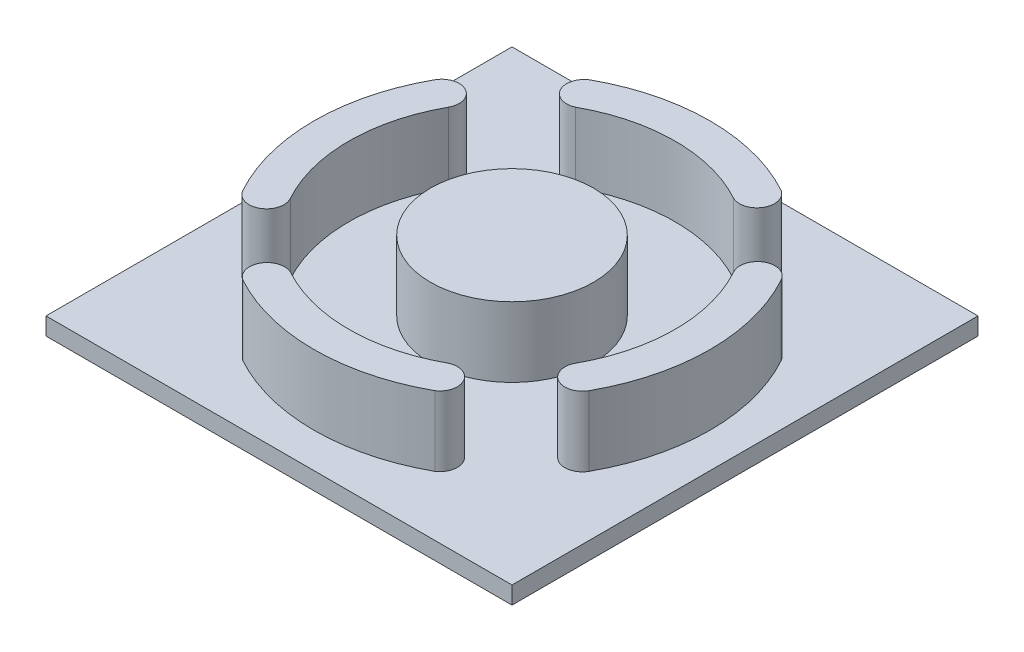
ISO-10303-21;
HEADER;
FILE_DESCRIPTION(('STEP AP214'),'2;1');
FILE_NAME('part.step','',(''),(''),'','','');
FILE_SCHEMA(('AUTOMOTIVE_DESIGN { 1 0 10303 214 1 1 1 1 }'));
ENDSEC;
DATA;
#1=APPLICATION_CONTEXT('core data for automotive mechanical design processes');
#2=APPLICATION_PROTOCOL_DEFINITION('international standard','automotive_design',2000,#1);
#3=PRODUCT_CONTEXT('',#1,'mechanical');
#4=PRODUCT('Part','Part','',(#3));
#5=PRODUCT_RELATED_PRODUCT_CATEGORY('part','',(#4));
#6=PRODUCT_DEFINITION_FORMATION('','',#4);
#7=PRODUCT_DEFINITION_CONTEXT('part definition',#1,'design');
#8=PRODUCT_DEFINITION('design','',#6,#7);
#9=PRODUCT_DEFINITION_SHAPE('','',#8);
#10=(LENGTH_UNIT() NAMED_UNIT(*) SI_UNIT(.MILLI.,.METRE.));
#11=(NAMED_UNIT(*) PLANE_ANGLE_UNIT() SI_UNIT($,.RADIAN.));
#12=(NAMED_UNIT(*) SI_UNIT($,.STERADIAN.) SOLID_ANGLE_UNIT());
#13=UNCERTAINTY_MEASURE_WITH_UNIT(LENGTH_MEASURE(1.E-05),#10,'distance_accuracy_value','');
#14=(GEOMETRIC_REPRESENTATION_CONTEXT(3) GLOBAL_UNCERTAINTY_ASSIGNED_CONTEXT((#13)) GLOBAL_UNIT_ASSIGNED_CONTEXT((#10,
#11,#12)) REPRESENTATION_CONTEXT('',''));
#15=CARTESIAN_POINT('',(0.,0.,0.));
#16=DIRECTION('',(0.,0.,1.));
#17=DIRECTION('',(1.,0.,0.));
#18=AXIS2_PLACEMENT_3D('',#15,#16,#17);
#19=CARTESIAN_POINT('',(0.,1.5,0.));
#20=DIRECTION('',(0.,-1.,0.));
#21=DIRECTION('',(0.,0.,-1.));
#22=AXIS2_PLACEMENT_3D('',#19,#20,#21);
#23=PLANE('',#22);
#24=CARTESIAN_POINT('',(-7.41585998364444,1.5,-6.38869026120404));
#25=DIRECTION('',(0.,1.,0.));
#26=DIRECTION('',(0.,0.,-1.));
#27=AXIS2_PLACEMENT_3D('',#24,#25,#26);
#28=CIRCLE('',#27,1.50423804713908);
#29=CARTESIAN_POINT('',(-6.78733468344874,1.5,-7.75532410004849));
#30=VERTEX_POINT('',#29);
#31=CARTESIAN_POINT('',(-8.24176354418776,1.5,-5.13146497863028));
#32=VERTEX_POINT('',#31);
#33=EDGE_CURVE('E234',#30,#32,#28,.T.);
#34=ORIENTED_EDGE('',*,*,#33,.F.);
#35=CARTESIAN_POINT('',(0.,1.5,-20.));
#36=DIRECTION('',(0.,-1.,0.));
#37=DIRECTION('',(0.,0.,1.));
#38=AXIS2_PLACEMENT_3D('',#35,#36,#37);
#39=CIRCLE('',#38,14.);
#40=CARTESIAN_POINT('',(6.78733468344874,1.5,-7.75532410004848));
#41=VERTEX_POINT('',#40);
#42=EDGE_CURVE('E239',#41,#30,#39,.T.);
#43=ORIENTED_EDGE('',*,*,#42,.F.);
#44=CARTESIAN_POINT('',(7.41585998364444,1.5,-6.38869026120404));
#45=DIRECTION('',(0.,1.,0.));
#46=DIRECTION('',(0.,0.,1.));
#47=AXIS2_PLACEMENT_3D('',#44,#45,#46);
#48=CIRCLE('',#47,1.50423804713908);
#49=CARTESIAN_POINT('',(8.24176354418776,1.5,-5.13146497863028));
#50=VERTEX_POINT('',#49);
#51=EDGE_CURVE('E251',#50,#41,#48,.T.);
#52=ORIENTED_EDGE('',*,*,#51,.F.);
#53=CARTESIAN_POINT('',(0.,1.5,-20.));
#54=DIRECTION('',(0.,1.,0.));
#55=DIRECTION('',(0.,0.,1.));
#56=AXIS2_PLACEMENT_3D('',#53,#54,#55);
#57=CIRCLE('',#56,17.);
#58=EDGE_CURVE('E248',#32,#50,#57,.T.);
#59=ORIENTED_EDGE('',*,*,#58,.F.);
#60=EDGE_LOOP('',(#34,#43,#52,#59));
#61=FACE_BOUND('',#60,.T.);
#62=CARTESIAN_POINT('',(-7.41585998364444,1.5,-33.611309738796));
#63=DIRECTION('',(0.,1.,0.));
#64=DIRECTION('',(0.,0.,1.));
#65=AXIS2_PLACEMENT_3D('',#62,#63,#64);
#66=CIRCLE('',#65,1.50423804713908);
#67=CARTESIAN_POINT('',(-8.24176354418776,1.5,-34.8685350213697));
#68=VERTEX_POINT('',#67);
#69=CARTESIAN_POINT('',(-6.78733468344874,1.5,-32.2446758999515));
#70=VERTEX_POINT('',#69);
#71=EDGE_CURVE('E267',#68,#70,#66,.T.);
#72=ORIENTED_EDGE('',*,*,#71,.F.);
#73=CARTESIAN_POINT('',(0.,1.5,-20.));
#74=DIRECTION('',(0.,1.,0.));
#75=DIRECTION('',(0.,0.,-1.));
#76=AXIS2_PLACEMENT_3D('',#73,#74,#75);
#77=CIRCLE('',#76,17.);
#78=CARTESIAN_POINT('',(8.24176354418776,1.5,-34.8685350213697));
#79=VERTEX_POINT('',#78);
#80=EDGE_CURVE('E272',#79,#68,#77,.T.);
#81=ORIENTED_EDGE('',*,*,#80,.F.);
#82=CARTESIAN_POINT('',(7.41585998364444,1.5,-33.611309738796));
#83=DIRECTION('',(0.,1.,0.));
#84=DIRECTION('',(0.,0.,-1.));
#85=AXIS2_PLACEMENT_3D('',#82,#83,#84);
#86=CIRCLE('',#85,1.50423804713908);
#87=CARTESIAN_POINT('',(6.78733468344874,1.5,-32.2446758999515));
#88=VERTEX_POINT('',#87);
#89=EDGE_CURVE('E284',#88,#79,#86,.T.);
#90=ORIENTED_EDGE('',*,*,#89,.F.);
#91=CARTESIAN_POINT('',(0.,1.5,-20.));
#92=DIRECTION('',(0.,-1.,0.));
#93=DIRECTION('',(0.,0.,-1.));
#94=AXIS2_PLACEMENT_3D('',#91,#92,#93);
#95=CIRCLE('',#94,14.);
#96=EDGE_CURVE('E281',#70,#88,#95,.T.);
#97=ORIENTED_EDGE('',*,*,#96,.F.);
#98=EDGE_LOOP('',(#72,#81,#90,#97));
#99=FACE_BOUND('',#98,.T.);
#100=CARTESIAN_POINT('',(0.,1.5,-20.));
#101=DIRECTION('',(0.,1.,0.));
#102=DIRECTION('',(0.,0.,1.));
#103=AXIS2_PLACEMENT_3D('',#100,#101,#102);
#104=CIRCLE('',#103,7.);
#105=CARTESIAN_POINT('',(0.,1.5,-13.));
#106=VERTEX_POINT('',#105);
#107=EDGE_CURVE('E11',#106,#106,#104,.T.);
#108=ORIENTED_EDGE('',*,*,#107,.F.);
#109=EDGE_LOOP('',(#108));
#110=FACE_BOUND('',#109,.T.);
#111=DIRECTION('',(0.,0.,1.));
#112=VECTOR('',#111,1.);
#113=CARTESIAN_POINT('',(-20.,1.5,0.));
#114=LINE('',#113,#112);
#115=CARTESIAN_POINT('',(-20.,1.5,-40.));
#116=VERTEX_POINT('',#115);
#117=CARTESIAN_POINT('',(-20.,1.5,0.));
#118=VERTEX_POINT('',#117);
#119=EDGE_CURVE('E304',#116,#118,#114,.T.);
#120=ORIENTED_EDGE('',*,*,#119,.T.);
#121=DIRECTION('',(1.,0.,0.));
#122=VECTOR('',#121,1.);
#123=CARTESIAN_POINT('',(20.,1.5,0.));
#124=LINE('',#123,#122);
#125=CARTESIAN_POINT('',(20.,1.5,0.));
#126=VERTEX_POINT('',#125);
#127=EDGE_CURVE('E307',#118,#126,#124,.T.);
#128=ORIENTED_EDGE('',*,*,#127,.T.);
#129=DIRECTION('',(0.,0.,-1.));
#130=VECTOR('',#129,1.);
#131=CARTESIAN_POINT('',(20.,1.5,-40.));
#132=LINE('',#131,#130);
#133=CARTESIAN_POINT('',(20.,1.5,-40.));
#134=VERTEX_POINT('',#133);
#135=EDGE_CURVE('E310',#126,#134,#132,.T.);
#136=ORIENTED_EDGE('',*,*,#135,.T.);
#137=DIRECTION('',(-1.,0.,0.));
#138=VECTOR('',#137,1.);
#139=CARTESIAN_POINT('',(-20.,1.5,-40.));
#140=LINE('',#139,#138);
#141=EDGE_CURVE('E312',#134,#116,#140,.T.);
#142=ORIENTED_EDGE('',*,*,#141,.T.);
#143=EDGE_LOOP('',(#120,#128,#136,#142));
#144=FACE_BOUND('',#143,.T.);
#145=CARTESIAN_POINT('',(13.5566054606606,1.5,-27.5145491138183));
#146=DIRECTION('',(0.,1.,0.));
#147=DIRECTION('',(0.,0.,-1.));
#148=AXIS2_PLACEMENT_3D('',#145,#146,#147);
#149=CIRCLE('',#148,1.5);
#150=CARTESIAN_POINT('',(14.8685350213697,1.5,-28.2417635441878));
#151=VERTEX_POINT('',#150);
#152=CARTESIAN_POINT('',(12.2446758999515,1.5,-26.7873346834487));
#153=VERTEX_POINT('',#152);
#154=EDGE_CURVE('E196',#151,#153,#149,.T.);
#155=ORIENTED_EDGE('',*,*,#154,.F.);
#156=CARTESIAN_POINT('',(0.,1.5,-20.));
#157=DIRECTION('',(0.,1.,0.));
#158=DIRECTION('',(0.,0.,-1.));
#159=AXIS2_PLACEMENT_3D('',#156,#157,#158);
#160=CIRCLE('',#159,17.);
#161=CARTESIAN_POINT('',(14.8685350213697,1.5,-11.7582364558123));
#162=VERTEX_POINT('',#161);
#163=EDGE_CURVE('E209',#162,#151,#160,.T.);
#164=ORIENTED_EDGE('',*,*,#163,.F.);
#165=CARTESIAN_POINT('',(13.5566054606606,1.5,-12.4854508861818));
#166=DIRECTION('',(0.,1.,0.));
#167=DIRECTION('',(0.,0.,1.));
#168=AXIS2_PLACEMENT_3D('',#165,#166,#167);
#169=CIRCLE('',#168,1.5);
#170=CARTESIAN_POINT('',(12.2446758999515,1.5,-13.2126653165513));
#171=VERTEX_POINT('',#170);
#172=EDGE_CURVE('E218',#171,#162,#169,.T.);
#173=ORIENTED_EDGE('',*,*,#172,.F.);
#174=CARTESIAN_POINT('',(0.,1.5,-20.));
#175=DIRECTION('',(0.,-1.,0.));
#176=DIRECTION('',(0.,0.,-1.));
#177=AXIS2_PLACEMENT_3D('',#174,#175,#176);
#178=CIRCLE('',#177,14.);
#179=EDGE_CURVE('E199',#153,#171,#178,.T.);
#180=ORIENTED_EDGE('',*,*,#179,.F.);
#181=EDGE_LOOP('',(#155,#164,#173,#180));
#182=FACE_BOUND('',#181,.T.);
#183=CARTESIAN_POINT('',(-13.5566054606606,1.5,-27.5145491138182));
#184=DIRECTION('',(0.,1.,0.));
#185=DIRECTION('',(0.,0.,1.));
#186=AXIS2_PLACEMENT_3D('',#183,#184,#185);
#187=CIRCLE('',#186,1.5);
#188=CARTESIAN_POINT('',(-12.2446758999515,1.5,-26.7873346834487));
#189=VERTEX_POINT('',#188);
#190=CARTESIAN_POINT('',(-14.8685350213697,1.5,-28.2417635441878));
#191=VERTEX_POINT('',#190);
#192=EDGE_CURVE('E195',#189,#191,#187,.T.);
#193=ORIENTED_EDGE('',*,*,#192,.F.);
#194=CARTESIAN_POINT('',(0.,1.5,-20.));
#195=DIRECTION('',(0.,-1.,0.));
#196=DIRECTION('',(0.,0.,1.));
#197=AXIS2_PLACEMENT_3D('',#194,#195,#196);
#198=CIRCLE('',#197,14.);
#199=CARTESIAN_POINT('',(-12.2446758999515,1.5,-13.2126653165513));
#200=VERTEX_POINT('',#199);
#201=EDGE_CURVE('E192',#200,#189,#198,.T.);
#202=ORIENTED_EDGE('',*,*,#201,.F.);
#203=CARTESIAN_POINT('',(-13.5566054606606,1.5,-12.4854508861818));
#204=DIRECTION('',(0.,1.,0.));
#205=DIRECTION('',(0.,0.,-1.));
#206=AXIS2_PLACEMENT_3D('',#203,#204,#205);
#207=CIRCLE('',#206,1.5);
#208=CARTESIAN_POINT('',(-14.8685350213697,1.5,-11.7582364558122));
#209=VERTEX_POINT('',#208);
#210=EDGE_CURVE('E58',#209,#200,#207,.T.);
#211=ORIENTED_EDGE('',*,*,#210,.F.);
#212=CARTESIAN_POINT('',(0.,1.5,-20.));
#213=DIRECTION('',(0.,1.,0.));
#214=DIRECTION('',(0.,0.,1.));
#215=AXIS2_PLACEMENT_3D('',#212,#213,#214);
#216=CIRCLE('',#215,17.);
#217=EDGE_CURVE('E53',#191,#209,#216,.T.);
#218=ORIENTED_EDGE('',*,*,#217,.F.);
#219=EDGE_LOOP('',(#193,#202,#211,#218));
#220=FACE_BOUND('',#219,.T.);
#221=ADVANCED_FACE('F37',(#61,#99,#110,#144,#182,#220),#23,.F.);
#222=CARTESIAN_POINT('',(-20.,1.5,0.));
#223=DIRECTION('',(1.,0.,0.));
#224=DIRECTION('',(0.,0.,-1.));
#225=AXIS2_PLACEMENT_3D('',#222,#223,#224);
#226=PLANE('',#225);
#227=DIRECTION('',(0.,0.,1.));
#228=VECTOR('',#227,1.);
#229=CARTESIAN_POINT('',(-20.,0.,0.));
#230=LINE('',#229,#228);
#231=CARTESIAN_POINT('',(-20.,0.,-40.));
#232=VERTEX_POINT('',#231);
#233=CARTESIAN_POINT('',(-20.,0.,0.));
#234=VERTEX_POINT('',#233);
#235=EDGE_CURVE('E302',#232,#234,#230,.T.);
#236=ORIENTED_EDGE('',*,*,#235,.T.);
#237=DIRECTION('',(0.,-1.,0.));
#238=VECTOR('',#237,1.);
#239=CARTESIAN_POINT('',(-20.,1.5,0.));
#240=LINE('',#239,#238);
#241=EDGE_CURVE('E41',#118,#234,#240,.T.);
#242=ORIENTED_EDGE('',*,*,#241,.F.);
#243=ORIENTED_EDGE('',*,*,#119,.F.);
#244=DIRECTION('',(0.,-1.,0.));
#245=VECTOR('',#244,1.);
#246=CARTESIAN_POINT('',(-20.,1.5,-40.));
#247=LINE('',#246,#245);
#248=EDGE_CURVE('E314',#116,#232,#247,.T.);
#249=ORIENTED_EDGE('',*,*,#248,.T.);
#250=EDGE_LOOP('',(#236,#242,#243,#249));
#251=FACE_BOUND('',#250,.T.);
#252=ADVANCED_FACE('F39',(#251),#226,.F.);
#253=CARTESIAN_POINT('',(20.,1.5,0.));
#254=DIRECTION('',(0.,0.,-1.));
#255=DIRECTION('',(-1.,0.,0.));
#256=AXIS2_PLACEMENT_3D('',#253,#254,#255);
#257=PLANE('',#256);
#258=DIRECTION('',(1.,0.,0.));
#259=VECTOR('',#258,1.);
#260=CARTESIAN_POINT('',(20.,0.,0.));
#261=LINE('',#260,#259);
#262=CARTESIAN_POINT('',(20.,0.,0.));
#263=VERTEX_POINT('',#262);
#264=EDGE_CURVE('E317',#234,#263,#261,.T.);
#265=ORIENTED_EDGE('',*,*,#264,.T.);
#266=DIRECTION('',(0.,-1.,0.));
#267=VECTOR('',#266,1.);
#268=CARTESIAN_POINT('',(20.,1.5,0.));
#269=LINE('',#268,#267);
#270=EDGE_CURVE('E326',#126,#263,#269,.T.);
#271=ORIENTED_EDGE('',*,*,#270,.F.);
#272=ORIENTED_EDGE('',*,*,#127,.F.);
#273=ORIENTED_EDGE('',*,*,#241,.T.);
#274=EDGE_LOOP('',(#265,#271,#272,#273));
#275=FACE_BOUND('',#274,.T.);
#276=ADVANCED_FACE('F335',(#275),#257,.F.);
#277=CARTESIAN_POINT('',(20.,1.5,-40.));
#278=DIRECTION('',(-1.,0.,0.));
#279=DIRECTION('',(0.,0.,1.));
#280=AXIS2_PLACEMENT_3D('',#277,#278,#279);
#281=PLANE('',#280);
#282=DIRECTION('',(0.,0.,-1.));
#283=VECTOR('',#282,1.);
#284=CARTESIAN_POINT('',(20.,0.,-40.));
#285=LINE('',#284,#283);
#286=CARTESIAN_POINT('',(20.,0.,-40.));
#287=VERTEX_POINT('',#286);
#288=EDGE_CURVE('E319',#263,#287,#285,.T.);
#289=ORIENTED_EDGE('',*,*,#288,.T.);
#290=DIRECTION('',(0.,-1.,0.));
#291=VECTOR('',#290,1.);
#292=CARTESIAN_POINT('',(20.,1.5,-40.));
#293=LINE('',#292,#291);
#294=EDGE_CURVE('E324',#134,#287,#293,.T.);
#295=ORIENTED_EDGE('',*,*,#294,.F.);
#296=ORIENTED_EDGE('',*,*,#135,.F.);
#297=ORIENTED_EDGE('',*,*,#270,.T.);
#298=EDGE_LOOP('',(#289,#295,#296,#297));
#299=FACE_BOUND('',#298,.T.);
#300=ADVANCED_FACE('F344',(#299),#281,.F.);
#301=CARTESIAN_POINT('',(-20.,1.5,-40.));
#302=DIRECTION('',(0.,0.,1.));
#303=DIRECTION('',(1.,0.,0.));
#304=AXIS2_PLACEMENT_3D('',#301,#302,#303);
#305=PLANE('',#304);
#306=DIRECTION('',(-1.,0.,0.));
#307=VECTOR('',#306,1.);
#308=CARTESIAN_POINT('',(-20.,0.,-40.));
#309=LINE('',#308,#307);
#310=EDGE_CURVE('E308',#287,#232,#309,.T.);
#311=ORIENTED_EDGE('',*,*,#310,.T.);
#312=ORIENTED_EDGE('',*,*,#248,.F.);
#313=ORIENTED_EDGE('',*,*,#141,.F.);
#314=ORIENTED_EDGE('',*,*,#294,.T.);
#315=EDGE_LOOP('',(#311,#312,#313,#314));
#316=FACE_BOUND('',#315,.T.);
#317=ADVANCED_FACE('F347',(#316),#305,.F.);
#318=CARTESIAN_POINT('',(0.,0.,0.));
#319=DIRECTION('',(0.,-1.,0.));
#320=DIRECTION('',(0.,0.,-1.));
#321=AXIS2_PLACEMENT_3D('',#318,#319,#320);
#322=PLANE('',#321);
#323=ORIENTED_EDGE('',*,*,#235,.F.);
#324=ORIENTED_EDGE('',*,*,#310,.F.);
#325=ORIENTED_EDGE('',*,*,#288,.F.);
#326=ORIENTED_EDGE('',*,*,#264,.F.);
#327=EDGE_LOOP('',(#323,#324,#325,#326));
#328=FACE_BOUND('',#327,.T.);
#329=ADVANCED_FACE('F342',(#328),#322,.T.);
#330=CARTESIAN_POINT('',(0.,7.5,-20.));
#331=DIRECTION('',(0.,-1.,0.));
#332=DIRECTION('',(0.,0.,-1.));
#333=AXIS2_PLACEMENT_3D('',#330,#331,#332);
#334=CYLINDRICAL_SURFACE('',#333,7.);
#335=CARTESIAN_POINT('',(0.,7.5,-20.));
#336=DIRECTION('',(0.,1.,0.));
#337=DIRECTION('',(0.,0.,1.));
#338=AXIS2_PLACEMENT_3D('',#335,#336,#337);
#339=CIRCLE('',#338,7.);
#340=CARTESIAN_POINT('',(0.,7.5,-13.));
#341=VERTEX_POINT('',#340);
#342=EDGE_CURVE('E300',#341,#341,#339,.T.);
#343=ORIENTED_EDGE('',*,*,#342,.F.);
#344=EDGE_LOOP('',(#343));
#345=FACE_BOUND('',#344,.T.);
#346=ORIENTED_EDGE('',*,*,#107,.T.);
#347=EDGE_LOOP('',(#346));
#348=FACE_BOUND('',#347,.T.);
#349=ADVANCED_FACE('F443',(#345,#348),#334,.T.);
#350=CARTESIAN_POINT('',(0.,7.5,-20.));
#351=DIRECTION('',(0.,1.,0.));
#352=DIRECTION('',(0.,0.,1.));
#353=AXIS2_PLACEMENT_3D('',#350,#351,#352);
#354=PLANE('',#353);
#355=ORIENTED_EDGE('',*,*,#342,.T.);
#356=EDGE_LOOP('',(#355));
#357=FACE_BOUND('',#356,.T.);
#358=ADVANCED_FACE('F439',(#357),#354,.T.);
#359=CARTESIAN_POINT('',(-7.41585998364444,7.5,-33.611309738796));
#360=DIRECTION('',(0.,-1.,0.));
#361=DIRECTION('',(0.,0.,-1.));
#362=AXIS2_PLACEMENT_3D('',#359,#360,#361);
#363=CYLINDRICAL_SURFACE('',#362,1.50423804713908);
#364=ORIENTED_EDGE('',*,*,#71,.T.);
#365=DIRECTION('',(0.,-1.,0.));
#366=VECTOR('',#365,1.);
#367=CARTESIAN_POINT('',(-6.78733468344874,7.5,-32.2446758999515));
#368=LINE('',#367,#366);
#369=CARTESIAN_POINT('',(-6.78733468344874,7.5,-32.2446758999515));
#370=VERTEX_POINT('',#369);
#371=EDGE_CURVE('E297',#370,#70,#368,.T.);
#372=ORIENTED_EDGE('',*,*,#371,.F.);
#373=CARTESIAN_POINT('',(-7.41585998364444,7.5,-33.611309738796));
#374=DIRECTION('',(0.,1.,0.));
#375=DIRECTION('',(0.,0.,1.));
#376=AXIS2_PLACEMENT_3D('',#373,#374,#375);
#377=CIRCLE('',#376,1.50423804713908);
#378=CARTESIAN_POINT('',(-8.24176354418776,7.5,-34.8685350213697));
#379=VERTEX_POINT('',#378);
#380=EDGE_CURVE('E268',#379,#370,#377,.T.);
#381=ORIENTED_EDGE('',*,*,#380,.F.);
#382=DIRECTION('',(0.,-1.,0.));
#383=VECTOR('',#382,1.);
#384=CARTESIAN_POINT('',(-8.24176354418776,7.5,-34.8685350213697));
#385=LINE('',#384,#383);
#386=EDGE_CURVE('E278',#379,#68,#385,.T.);
#387=ORIENTED_EDGE('',*,*,#386,.T.);
#388=EDGE_LOOP('',(#364,#372,#381,#387));
#389=FACE_BOUND('',#388,.T.);
#390=ADVANCED_FACE('F435',(#389),#363,.T.);
#391=CARTESIAN_POINT('',(0.,7.5,-20.));
#392=DIRECTION('',(0.,-1.,0.));
#393=DIRECTION('',(0.,0.,-1.));
#394=AXIS2_PLACEMENT_3D('',#391,#392,#393);
#395=CYLINDRICAL_SURFACE('',#394,14.);
#396=ORIENTED_EDGE('',*,*,#96,.T.);
#397=DIRECTION('',(0.,-1.,0.));
#398=VECTOR('',#397,1.);
#399=CARTESIAN_POINT('',(6.78733468344874,7.5,-32.2446758999515));
#400=LINE('',#399,#398);
#401=CARTESIAN_POINT('',(6.78733468344874,7.5,-32.2446758999515));
#402=VERTEX_POINT('',#401);
#403=EDGE_CURVE('E294',#402,#88,#400,.T.);
#404=ORIENTED_EDGE('',*,*,#403,.F.);
#405=CARTESIAN_POINT('',(0.,7.5,-20.));
#406=DIRECTION('',(0.,-1.,0.));
#407=DIRECTION('',(0.,0.,-1.));
#408=AXIS2_PLACEMENT_3D('',#405,#406,#407);
#409=CIRCLE('',#408,14.);
#410=EDGE_CURVE('E271',#370,#402,#409,.T.);
#411=ORIENTED_EDGE('',*,*,#410,.F.);
#412=ORIENTED_EDGE('',*,*,#371,.T.);
#413=EDGE_LOOP('',(#396,#404,#411,#412));
#414=FACE_BOUND('',#413,.T.);
#415=ADVANCED_FACE('F431',(#414),#395,.F.);
#416=CARTESIAN_POINT('',(7.41585998364444,7.5,-33.611309738796));
#417=DIRECTION('',(0.,-1.,0.));
#418=DIRECTION('',(0.,0.,-1.));
#419=AXIS2_PLACEMENT_3D('',#416,#417,#418);
#420=CYLINDRICAL_SURFACE('',#419,1.50423804713908);
#421=ORIENTED_EDGE('',*,*,#89,.T.);
#422=DIRECTION('',(0.,-1.,0.));
#423=VECTOR('',#422,1.);
#424=CARTESIAN_POINT('',(8.24176354418775,7.5,-34.8685350213697));
#425=LINE('',#424,#423);
#426=CARTESIAN_POINT('',(8.24176354418775,7.5,-34.8685350213697));
#427=VERTEX_POINT('',#426);
#428=EDGE_CURVE('E291',#427,#79,#425,.T.);
#429=ORIENTED_EDGE('',*,*,#428,.F.);
#430=CARTESIAN_POINT('',(7.41585998364444,7.5,-33.611309738796));
#431=DIRECTION('',(0.,1.,0.));
#432=DIRECTION('',(0.,0.,-1.));
#433=AXIS2_PLACEMENT_3D('',#430,#431,#432);
#434=CIRCLE('',#433,1.50423804713908);
#435=EDGE_CURVE('E274',#402,#427,#434,.T.);
#436=ORIENTED_EDGE('',*,*,#435,.F.);
#437=ORIENTED_EDGE('',*,*,#403,.T.);
#438=EDGE_LOOP('',(#421,#429,#436,#437));
#439=FACE_BOUND('',#438,.T.);
#440=ADVANCED_FACE('F427',(#439),#420,.T.);
#441=CARTESIAN_POINT('',(0.,7.5,-20.));
#442=DIRECTION('',(0.,-1.,0.));
#443=DIRECTION('',(0.,0.,-1.));
#444=AXIS2_PLACEMENT_3D('',#441,#442,#443);
#445=CYLINDRICAL_SURFACE('',#444,17.);
#446=ORIENTED_EDGE('',*,*,#80,.T.);
#447=ORIENTED_EDGE('',*,*,#386,.F.);
#448=CARTESIAN_POINT('',(0.,7.5,-20.));
#449=DIRECTION('',(0.,1.,0.));
#450=DIRECTION('',(0.,0.,-1.));
#451=AXIS2_PLACEMENT_3D('',#448,#449,#450);
#452=CIRCLE('',#451,17.);
#453=EDGE_CURVE('E276',#427,#379,#452,.T.);
#454=ORIENTED_EDGE('',*,*,#453,.F.);
#455=ORIENTED_EDGE('',*,*,#428,.T.);
#456=EDGE_LOOP('',(#446,#447,#454,#455));
#457=FACE_BOUND('',#456,.T.);
#458=ADVANCED_FACE('F423',(#457),#445,.T.);
#459=CARTESIAN_POINT('',(-3.70792999182222,7.5,-26.805654869398));
#460=DIRECTION('',(0.,1.,0.));
#461=DIRECTION('',(0.,0.,1.));
#462=AXIS2_PLACEMENT_3D('',#459,#460,#461);
#463=PLANE('',#462);
#464=ORIENTED_EDGE('',*,*,#380,.T.);
#465=ORIENTED_EDGE('',*,*,#410,.T.);
#466=ORIENTED_EDGE('',*,*,#435,.T.);
#467=ORIENTED_EDGE('',*,*,#453,.T.);
#468=EDGE_LOOP('',(#464,#465,#466,#467));
#469=FACE_BOUND('',#468,.T.);
#470=ADVANCED_FACE('F419',(#469),#463,.T.);
#471=CARTESIAN_POINT('',(-7.41585998364444,7.5,-6.38869026120404));
#472=DIRECTION('',(0.,-1.,0.));
#473=DIRECTION('',(0.,0.,-1.));
#474=AXIS2_PLACEMENT_3D('',#471,#472,#473);
#475=CYLINDRICAL_SURFACE('',#474,1.50423804713908);
#476=ORIENTED_EDGE('',*,*,#33,.T.);
#477=DIRECTION('',(0.,-1.,0.));
#478=VECTOR('',#477,1.);
#479=CARTESIAN_POINT('',(-8.24176354418776,7.5,-5.13146497863028));
#480=LINE('',#479,#478);
#481=CARTESIAN_POINT('',(-8.24176354418776,7.5,-5.13146497863028));
#482=VERTEX_POINT('',#481);
#483=EDGE_CURVE('E264',#482,#32,#480,.T.);
#484=ORIENTED_EDGE('',*,*,#483,.F.);
#485=CARTESIAN_POINT('',(-7.41585998364444,7.5,-6.38869026120404));
#486=DIRECTION('',(0.,1.,0.));
#487=DIRECTION('',(0.,0.,-1.));
#488=AXIS2_PLACEMENT_3D('',#485,#486,#487);
#489=CIRCLE('',#488,1.50423804713908);
#490=CARTESIAN_POINT('',(-6.78733468344874,7.5,-7.75532410004849));
#491=VERTEX_POINT('',#490);
#492=EDGE_CURVE('E235',#491,#482,#489,.T.);
#493=ORIENTED_EDGE('',*,*,#492,.F.);
#494=DIRECTION('',(0.,-1.,0.));
#495=VECTOR('',#494,1.);
#496=CARTESIAN_POINT('',(-6.78733468344874,7.5,-7.75532410004849));
#497=LINE('',#496,#495);
#498=EDGE_CURVE('E245',#491,#30,#497,.T.);
#499=ORIENTED_EDGE('',*,*,#498,.T.);
#500=EDGE_LOOP('',(#476,#484,#493,#499));
#501=FACE_BOUND('',#500,.T.);
#502=ADVANCED_FACE('F415',(#501),#475,.T.);
#503=CARTESIAN_POINT('',(0.,7.5,-20.));
#504=DIRECTION('',(0.,-1.,0.));
#505=DIRECTION('',(0.,0.,-1.));
#506=AXIS2_PLACEMENT_3D('',#503,#504,#505);
#507=CYLINDRICAL_SURFACE('',#506,17.);
#508=ORIENTED_EDGE('',*,*,#58,.T.);
#509=DIRECTION('',(0.,-1.,0.));
#510=VECTOR('',#509,1.);
#511=CARTESIAN_POINT('',(8.24176354418776,7.5,-5.13146497863028));
#512=LINE('',#511,#510);
#513=CARTESIAN_POINT('',(8.24176354418776,7.5,-5.13146497863028));
#514=VERTEX_POINT('',#513);
#515=EDGE_CURVE('E261',#514,#50,#512,.T.);
#516=ORIENTED_EDGE('',*,*,#515,.F.);
#517=CARTESIAN_POINT('',(0.,7.5,-20.));
#518=DIRECTION('',(0.,1.,0.));
#519=DIRECTION('',(0.,0.,1.));
#520=AXIS2_PLACEMENT_3D('',#517,#518,#519);
#521=CIRCLE('',#520,17.);
#522=EDGE_CURVE('E238',#482,#514,#521,.T.);
#523=ORIENTED_EDGE('',*,*,#522,.F.);
#524=ORIENTED_EDGE('',*,*,#483,.T.);
#525=EDGE_LOOP('',(#508,#516,#523,#524));
#526=FACE_BOUND('',#525,.T.);
#527=ADVANCED_FACE('F411',(#526),#507,.T.);
#528=CARTESIAN_POINT('',(7.41585998364444,7.5,-6.38869026120404));
#529=DIRECTION('',(0.,-1.,0.));
#530=DIRECTION('',(0.,0.,-1.));
#531=AXIS2_PLACEMENT_3D('',#528,#529,#530);
#532=CYLINDRICAL_SURFACE('',#531,1.50423804713908);
#533=ORIENTED_EDGE('',*,*,#51,.T.);
#534=DIRECTION('',(0.,-1.,0.));
#535=VECTOR('',#534,1.);
#536=CARTESIAN_POINT('',(6.78733468344874,7.5,-7.75532410004848));
#537=LINE('',#536,#535);
#538=CARTESIAN_POINT('',(6.78733468344874,7.5,-7.75532410004848));
#539=VERTEX_POINT('',#538);
#540=EDGE_CURVE('E258',#539,#41,#537,.T.);
#541=ORIENTED_EDGE('',*,*,#540,.F.);
#542=CARTESIAN_POINT('',(7.41585998364444,7.5,-6.38869026120404));
#543=DIRECTION('',(0.,1.,0.));
#544=DIRECTION('',(0.,0.,1.));
#545=AXIS2_PLACEMENT_3D('',#542,#543,#544);
#546=CIRCLE('',#545,1.50423804713908);
#547=EDGE_CURVE('E241',#514,#539,#546,.T.);
#548=ORIENTED_EDGE('',*,*,#547,.F.);
#549=ORIENTED_EDGE('',*,*,#515,.T.);
#550=EDGE_LOOP('',(#533,#541,#548,#549));
#551=FACE_BOUND('',#550,.T.);
#552=ADVANCED_FACE('F407',(#551),#532,.T.);
#553=CARTESIAN_POINT('',(0.,7.5,-20.));
#554=DIRECTION('',(0.,-1.,0.));
#555=DIRECTION('',(0.,0.,-1.));
#556=AXIS2_PLACEMENT_3D('',#553,#554,#555);
#557=CYLINDRICAL_SURFACE('',#556,14.);
#558=ORIENTED_EDGE('',*,*,#42,.T.);
#559=ORIENTED_EDGE('',*,*,#498,.F.);
#560=CARTESIAN_POINT('',(0.,7.5,-20.));
#561=DIRECTION('',(0.,-1.,0.));
#562=DIRECTION('',(0.,0.,1.));
#563=AXIS2_PLACEMENT_3D('',#560,#561,#562);
#564=CIRCLE('',#563,14.);
#565=EDGE_CURVE('E243',#539,#491,#564,.T.);
#566=ORIENTED_EDGE('',*,*,#565,.F.);
#567=ORIENTED_EDGE('',*,*,#540,.T.);
#568=EDGE_LOOP('',(#558,#559,#566,#567));
#569=FACE_BOUND('',#568,.T.);
#570=ADVANCED_FACE('F403',(#569),#557,.F.);
#571=CARTESIAN_POINT('',(-3.70792999182222,7.5,-13.194345130602));
#572=DIRECTION('',(0.,-1.,0.));
#573=DIRECTION('',(0.,0.,-1.));
#574=AXIS2_PLACEMENT_3D('',#571,#572,#573);
#575=PLANE('',#574);
#576=ORIENTED_EDGE('',*,*,#492,.T.);
#577=ORIENTED_EDGE('',*,*,#522,.T.);
#578=ORIENTED_EDGE('',*,*,#547,.T.);
#579=ORIENTED_EDGE('',*,*,#565,.T.);
#580=EDGE_LOOP('',(#576,#577,#578,#579));
#581=FACE_BOUND('',#580,.T.);
#582=ADVANCED_FACE('F399',(#581),#575,.F.);
#583=CARTESIAN_POINT('',(13.5566054606606,7.5,-27.5145491138183));
#584=DIRECTION('',(0.,-1.,0.));
#585=DIRECTION('',(0.,0.,-1.));
#586=AXIS2_PLACEMENT_3D('',#583,#584,#585);
#587=CYLINDRICAL_SURFACE('',#586,1.5);
#588=ORIENTED_EDGE('',*,*,#154,.T.);
#589=DIRECTION('',(0.,-1.,0.));
#590=VECTOR('',#589,1.);
#591=CARTESIAN_POINT('',(12.2446758999515,7.5,-26.7873346834487));
#592=LINE('',#591,#590);
#593=CARTESIAN_POINT('',(12.2446758999515,7.5,-26.7873346834487));
#594=VERTEX_POINT('',#593);
#595=EDGE_CURVE('E231',#594,#153,#592,.T.);
#596=ORIENTED_EDGE('',*,*,#595,.F.);
#597=CARTESIAN_POINT('',(13.5566054606606,7.5,-27.5145491138183));
#598=DIRECTION('',(0.,1.,0.));
#599=DIRECTION('',(0.,0.,-1.));
#600=AXIS2_PLACEMENT_3D('',#597,#598,#599);
#601=CIRCLE('',#600,1.5);
#602=CARTESIAN_POINT('',(14.8685350213697,7.5,-28.2417635441878));
#603=VERTEX_POINT('',#602);
#604=EDGE_CURVE('E205',#603,#594,#601,.T.);
#605=ORIENTED_EDGE('',*,*,#604,.F.);
#606=DIRECTION('',(0.,-1.,0.));
#607=VECTOR('',#606,1.);
#608=CARTESIAN_POINT('',(14.8685350213697,7.5,-28.2417635441878));
#609=LINE('',#608,#607);
#610=EDGE_CURVE('E214',#603,#151,#609,.T.);
#611=ORIENTED_EDGE('',*,*,#610,.T.);
#612=EDGE_LOOP('',(#588,#596,#605,#611));
#613=FACE_BOUND('',#612,.T.);
#614=ADVANCED_FACE('F395',(#613),#587,.T.);
#615=CARTESIAN_POINT('',(0.,7.5,-20.));
#616=DIRECTION('',(0.,-1.,0.));
#617=DIRECTION('',(0.,0.,-1.));
#618=AXIS2_PLACEMENT_3D('',#615,#616,#617);
#619=CYLINDRICAL_SURFACE('',#618,14.);
#620=ORIENTED_EDGE('',*,*,#179,.T.);
#621=DIRECTION('',(0.,-1.,0.));
#622=VECTOR('',#621,1.);
#623=CARTESIAN_POINT('',(12.2446758999515,7.5,-13.2126653165513));
#624=LINE('',#623,#622);
#625=CARTESIAN_POINT('',(12.2446758999515,7.5,-13.2126653165513));
#626=VERTEX_POINT('',#625);
#627=EDGE_CURVE('E228',#626,#171,#624,.T.);
#628=ORIENTED_EDGE('',*,*,#627,.F.);
#629=CARTESIAN_POINT('',(0.,7.5,-20.));
#630=DIRECTION('',(0.,-1.,0.));
#631=DIRECTION('',(0.,0.,-1.));
#632=AXIS2_PLACEMENT_3D('',#629,#630,#631);
#633=CIRCLE('',#632,14.);
#634=EDGE_CURVE('E208',#594,#626,#633,.T.);
#635=ORIENTED_EDGE('',*,*,#634,.F.);
#636=ORIENTED_EDGE('',*,*,#595,.T.);
#637=EDGE_LOOP('',(#620,#628,#635,#636));
#638=FACE_BOUND('',#637,.T.);
#639=ADVANCED_FACE('F391',(#638),#619,.F.);
#640=CARTESIAN_POINT('',(13.5566054606606,7.5,-12.4854508861818));
#641=DIRECTION('',(0.,-1.,0.));
#642=DIRECTION('',(0.,0.,-1.));
#643=AXIS2_PLACEMENT_3D('',#640,#641,#642);
#644=CYLINDRICAL_SURFACE('',#643,1.5);
#645=ORIENTED_EDGE('',*,*,#172,.T.);
#646=DIRECTION('',(0.,-1.,0.));
#647=VECTOR('',#646,1.);
#648=CARTESIAN_POINT('',(14.8685350213697,7.5,-11.7582364558123));
#649=LINE('',#648,#647);
#650=CARTESIAN_POINT('',(14.8685350213697,7.5,-11.7582364558123));
#651=VERTEX_POINT('',#650);
#652=EDGE_CURVE('E225',#651,#162,#649,.T.);
#653=ORIENTED_EDGE('',*,*,#652,.F.);
#654=CARTESIAN_POINT('',(13.5566054606606,7.5,-12.4854508861818));
#655=DIRECTION('',(0.,1.,0.));
#656=DIRECTION('',(0.,0.,1.));
#657=AXIS2_PLACEMENT_3D('',#654,#655,#656);
#658=CIRCLE('',#657,1.5);
#659=EDGE_CURVE('E211',#626,#651,#658,.T.);
#660=ORIENTED_EDGE('',*,*,#659,.F.);
#661=ORIENTED_EDGE('',*,*,#627,.T.);
#662=EDGE_LOOP('',(#645,#653,#660,#661));
#663=FACE_BOUND('',#662,.T.);
#664=ADVANCED_FACE('F387',(#663),#644,.T.);
#665=CARTESIAN_POINT('',(0.,7.5,-20.));
#666=DIRECTION('',(0.,-1.,0.));
#667=DIRECTION('',(0.,0.,-1.));
#668=AXIS2_PLACEMENT_3D('',#665,#666,#667);
#669=CYLINDRICAL_SURFACE('',#668,17.);
#670=ORIENTED_EDGE('',*,*,#163,.T.);
#671=ORIENTED_EDGE('',*,*,#610,.F.);
#672=CARTESIAN_POINT('',(0.,7.5,-20.));
#673=DIRECTION('',(0.,1.,0.));
#674=DIRECTION('',(0.,0.,-1.));
#675=AXIS2_PLACEMENT_3D('',#672,#673,#674);
#676=CIRCLE('',#675,17.);
#677=EDGE_CURVE('E213',#651,#603,#676,.T.);
#678=ORIENTED_EDGE('',*,*,#677,.F.);
#679=ORIENTED_EDGE('',*,*,#652,.T.);
#680=EDGE_LOOP('',(#670,#671,#678,#679));
#681=FACE_BOUND('',#680,.T.);
#682=ADVANCED_FACE('F383',(#681),#669,.T.);
#683=CARTESIAN_POINT('',(6.77830273033032,7.5,-23.7572745569091));
#684=DIRECTION('',(0.,-1.,0.));
#685=DIRECTION('',(0.,0.,-1.));
#686=AXIS2_PLACEMENT_3D('',#683,#684,#685);
#687=PLANE('',#686);
#688=ORIENTED_EDGE('',*,*,#604,.T.);
#689=ORIENTED_EDGE('',*,*,#634,.T.);
#690=ORIENTED_EDGE('',*,*,#659,.T.);
#691=ORIENTED_EDGE('',*,*,#677,.T.);
#692=EDGE_LOOP('',(#688,#689,#690,#691));
#693=FACE_BOUND('',#692,.T.);
#694=ADVANCED_FACE('F380',(#693),#687,.F.);
#695=CARTESIAN_POINT('',(-13.5566054606606,7.5,-27.5145491138182));
#696=DIRECTION('',(0.,-1.,0.));
#697=DIRECTION('',(0.,0.,-1.));
#698=AXIS2_PLACEMENT_3D('',#695,#696,#697);
#699=CYLINDRICAL_SURFACE('',#698,1.5);
#700=ORIENTED_EDGE('',*,*,#192,.T.);
#701=DIRECTION('',(0.,-1.,0.));
#702=VECTOR('',#701,1.);
#703=CARTESIAN_POINT('',(-14.8685350213697,7.5,-28.2417635441878));
#704=LINE('',#703,#702);
#705=CARTESIAN_POINT('',(-14.8685350213697,7.5,-28.2417635441878));
#706=VERTEX_POINT('',#705);
#707=EDGE_CURVE('E176',#706,#191,#704,.T.);
#708=ORIENTED_EDGE('',*,*,#707,.F.);
#709=CARTESIAN_POINT('',(-13.5566054606606,7.5,-27.5145491138182));
#710=DIRECTION('',(0.,1.,0.));
#711=DIRECTION('',(0.,0.,1.));
#712=AXIS2_PLACEMENT_3D('',#709,#710,#711);
#713=CIRCLE('',#712,1.5);
#714=CARTESIAN_POINT('',(-12.2446758999515,7.5,-26.7873346834487));
#715=VERTEX_POINT('',#714);
#716=EDGE_CURVE('E183',#715,#706,#713,.T.);
#717=ORIENTED_EDGE('',*,*,#716,.F.);
#718=DIRECTION('',(0.,-1.,0.));
#719=VECTOR('',#718,1.);
#720=CARTESIAN_POINT('',(-12.2446758999515,7.5,-26.7873346834487));
#721=LINE('',#720,#719);
#722=EDGE_CURVE('E358',#715,#189,#721,.T.);
#723=ORIENTED_EDGE('',*,*,#722,.T.);
#724=EDGE_LOOP('',(#700,#708,#717,#723));
#725=FACE_BOUND('',#724,.T.);
#726=ADVANCED_FACE('F194',(#725),#699,.T.);
#727=CARTESIAN_POINT('',(0.,7.5,-20.));
#728=DIRECTION('',(0.,-1.,0.));
#729=DIRECTION('',(0.,0.,-1.));
#730=AXIS2_PLACEMENT_3D('',#727,#728,#729);
#731=CYLINDRICAL_SURFACE('',#730,17.);
#732=ORIENTED_EDGE('',*,*,#217,.T.);
#733=DIRECTION('',(0.,-1.,0.));
#734=VECTOR('',#733,1.);
#735=CARTESIAN_POINT('',(-14.8685350213697,7.5,-11.7582364558122));
#736=LINE('',#735,#734);
#737=CARTESIAN_POINT('',(-14.8685350213697,7.5,-11.7582364558122));
#738=VERTEX_POINT('',#737);
#739=EDGE_CURVE('E179',#738,#209,#736,.T.);
#740=ORIENTED_EDGE('',*,*,#739,.F.);
#741=CARTESIAN_POINT('',(0.,7.5,-20.));
#742=DIRECTION('',(0.,1.,0.));
#743=DIRECTION('',(0.,0.,1.));
#744=AXIS2_PLACEMENT_3D('',#741,#742,#743);
#745=CIRCLE('',#744,17.);
#746=EDGE_CURVE('E172',#706,#738,#745,.T.);
#747=ORIENTED_EDGE('',*,*,#746,.F.);
#748=ORIENTED_EDGE('',*,*,#707,.T.);
#749=EDGE_LOOP('',(#732,#740,#747,#748));
#750=FACE_BOUND('',#749,.T.);
#751=ADVANCED_FACE('F174',(#750),#731,.T.);
#752=CARTESIAN_POINT('',(-13.5566054606606,7.5,-12.4854508861818));
#753=DIRECTION('',(0.,-1.,0.));
#754=DIRECTION('',(0.,0.,-1.));
#755=AXIS2_PLACEMENT_3D('',#752,#753,#754);
#756=CYLINDRICAL_SURFACE('',#755,1.5);
#757=ORIENTED_EDGE('',*,*,#210,.T.);
#758=DIRECTION('',(0.,-1.,0.));
#759=VECTOR('',#758,1.);
#760=CARTESIAN_POINT('',(-12.2446758999515,7.5,-13.2126653165513));
#761=LINE('',#760,#759);
#762=CARTESIAN_POINT('',(-12.2446758999515,7.5,-13.2126653165513));
#763=VERTEX_POINT('',#762);
#764=EDGE_CURVE('E201',#763,#200,#761,.T.);
#765=ORIENTED_EDGE('',*,*,#764,.F.);
#766=CARTESIAN_POINT('',(-13.5566054606606,7.5,-12.4854508861818));
#767=DIRECTION('',(0.,1.,0.));
#768=DIRECTION('',(0.,0.,-1.));
#769=AXIS2_PLACEMENT_3D('',#766,#767,#768);
#770=CIRCLE('',#769,1.5);
#771=EDGE_CURVE('E182',#738,#763,#770,.T.);
#772=ORIENTED_EDGE('',*,*,#771,.F.);
#773=ORIENTED_EDGE('',*,*,#739,.T.);
#774=EDGE_LOOP('',(#757,#765,#772,#773));
#775=FACE_BOUND('',#774,.T.);
#776=ADVANCED_FACE('F367',(#775),#756,.T.);
#777=CARTESIAN_POINT('',(0.,7.5,-20.));
#778=DIRECTION('',(0.,-1.,0.));
#779=DIRECTION('',(0.,0.,-1.));
#780=AXIS2_PLACEMENT_3D('',#777,#778,#779);
#781=CYLINDRICAL_SURFACE('',#780,14.);
#782=ORIENTED_EDGE('',*,*,#201,.T.);
#783=ORIENTED_EDGE('',*,*,#722,.F.);
#784=CARTESIAN_POINT('',(0.,7.5,-20.));
#785=DIRECTION('',(0.,-1.,0.));
#786=DIRECTION('',(0.,0.,1.));
#787=AXIS2_PLACEMENT_3D('',#784,#785,#786);
#788=CIRCLE('',#787,14.);
#789=EDGE_CURVE('E188',#763,#715,#788,.T.);
#790=ORIENTED_EDGE('',*,*,#789,.F.);
#791=ORIENTED_EDGE('',*,*,#764,.T.);
#792=EDGE_LOOP('',(#782,#783,#790,#791));
#793=FACE_BOUND('',#792,.T.);
#794=ADVANCED_FACE('F357',(#793),#781,.F.);
#795=CARTESIAN_POINT('',(-6.77830273033031,7.5,-23.7572745569091));
#796=DIRECTION('',(0.,1.,0.));
#797=DIRECTION('',(0.,0.,1.));
#798=AXIS2_PLACEMENT_3D('',#795,#796,#797);
#799=PLANE('',#798);
#800=ORIENTED_EDGE('',*,*,#716,.T.);
#801=ORIENTED_EDGE('',*,*,#746,.T.);
#802=ORIENTED_EDGE('',*,*,#771,.T.);
#803=ORIENTED_EDGE('',*,*,#789,.T.);
#804=EDGE_LOOP('',(#800,#801,#802,#803));
#805=FACE_BOUND('',#804,.T.);
#806=ADVANCED_FACE('F186',(#805),#799,.T.);
#807=CLOSED_SHELL('',(#221,#252,#276,#300,#317,#329,#349,#358,#390,#415,#440,#458,#470,#502,
#527,#552,#570,#582,#614,#639,#664,#682,#694,#726,#751,#776,#794,#806));
#808=MANIFOLD_SOLID_BREP('B2',#807);
#809=ADVANCED_BREP_SHAPE_REPRESENTATION('',(#18,#808),#14);
#810=SHAPE_DEFINITION_REPRESENTATION(#9,#809);
ENDSEC;
END-ISO-10303-21;
